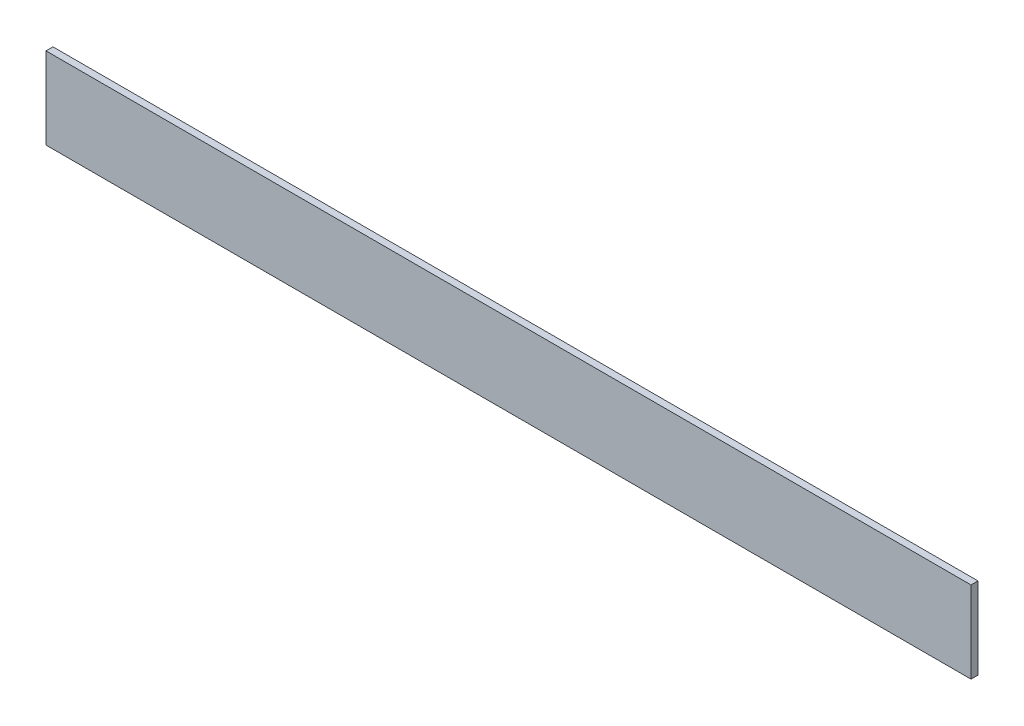
ISO-10303-21;
HEADER;
FILE_DESCRIPTION(('STEP AP214'),'2;1');
FILE_NAME('part.step','',(''),(''),'','','');
FILE_SCHEMA(('AUTOMOTIVE_DESIGN { 1 0 10303 214 1 1 1 1 }'));
ENDSEC;
DATA;
#1=APPLICATION_CONTEXT('core data for automotive mechanical design processes');
#2=APPLICATION_PROTOCOL_DEFINITION('international standard','automotive_design',2000,#1);
#3=PRODUCT_CONTEXT('',#1,'mechanical');
#4=PRODUCT('Part','Part','',(#3));
#5=PRODUCT_RELATED_PRODUCT_CATEGORY('part','',(#4));
#6=PRODUCT_DEFINITION_FORMATION('','',#4);
#7=PRODUCT_DEFINITION_CONTEXT('part definition',#1,'design');
#8=PRODUCT_DEFINITION('design','',#6,#7);
#9=PRODUCT_DEFINITION_SHAPE('','',#8);
#10=(LENGTH_UNIT() NAMED_UNIT(*) SI_UNIT(.MILLI.,.METRE.));
#11=(NAMED_UNIT(*) PLANE_ANGLE_UNIT() SI_UNIT($,.RADIAN.));
#12=(NAMED_UNIT(*) SI_UNIT($,.STERADIAN.) SOLID_ANGLE_UNIT());
#13=UNCERTAINTY_MEASURE_WITH_UNIT(LENGTH_MEASURE(1.E-05),#10,'distance_accuracy_value','');
#14=(GEOMETRIC_REPRESENTATION_CONTEXT(3) GLOBAL_UNCERTAINTY_ASSIGNED_CONTEXT((#13)) GLOBAL_UNIT_ASSIGNED_CONTEXT((#10,
#11,#12)) REPRESENTATION_CONTEXT('',''));
#15=CARTESIAN_POINT('',(0.,0.,0.));
#16=DIRECTION('',(0.,0.,1.));
#17=DIRECTION('',(1.,0.,0.));
#18=AXIS2_PLACEMENT_3D('',#15,#16,#17);
#19=CARTESIAN_POINT('',(215.9,-7.8994,7.8994));
#20=DIRECTION('',(0.,0.,1.));
#21=DIRECTION('',(1.,0.,0.));
#22=AXIS2_PLACEMENT_3D('',#19,#20,#21);
#23=PLANE('',#22);
#24=DIRECTION('',(0.,1.,0.));
#25=VECTOR('',#24,1.);
#26=CARTESIAN_POINT('',(0.,-7.8994,7.8994));
#27=LINE('',#26,#25);
#28=CARTESIAN_POINT('',(0.,-9.525,7.8994));
#29=VERTEX_POINT('',#28);
#30=CARTESIAN_POINT('',(0.,9.525,7.8994));
#31=VERTEX_POINT('',#30);
#32=EDGE_CURVE('E46',#29,#31,#27,.T.);
#33=ORIENTED_EDGE('',*,*,#32,.T.);
#34=DIRECTION('',(-1.,0.,0.));
#35=VECTOR('',#34,1.);
#36=CARTESIAN_POINT('',(215.9,9.525,7.8994));
#37=LINE('',#36,#35);
#38=CARTESIAN_POINT('',(215.9,9.525,7.8994));
#39=VERTEX_POINT('',#38);
#40=EDGE_CURVE('E11',#39,#31,#37,.T.);
#41=ORIENTED_EDGE('',*,*,#40,.F.);
#42=DIRECTION('',(0.,1.,0.));
#43=VECTOR('',#42,1.);
#44=CARTESIAN_POINT('',(215.9,-7.8994,7.8994));
#45=LINE('',#44,#43);
#46=CARTESIAN_POINT('',(215.9,-9.525,7.8994));
#47=VERTEX_POINT('',#46);
#48=EDGE_CURVE('E145',#47,#39,#45,.T.);
#49=ORIENTED_EDGE('',*,*,#48,.F.);
#50=DIRECTION('',(-1.,0.,0.));
#51=VECTOR('',#50,1.);
#52=CARTESIAN_POINT('',(215.9,-9.525,7.8994));
#53=LINE('',#52,#51);
#54=CARTESIAN_POINT('',(196.85,-9.525,7.8994));
#55=VERTEX_POINT('',#54);
#56=EDGE_CURVE('E125',#47,#55,#53,.T.);
#57=ORIENTED_EDGE('',*,*,#56,.T.);
#58=DIRECTION('',(0.,1.,0.));
#59=VECTOR('',#58,1.);
#60=CARTESIAN_POINT('',(196.85,-9.526,7.8994));
#61=LINE('',#60,#59);
#62=CARTESIAN_POINT('',(196.85,-7.8994,7.8994));
#63=VERTEX_POINT('',#62);
#64=EDGE_CURVE('E117',#55,#63,#61,.T.);
#65=ORIENTED_EDGE('',*,*,#64,.T.);
#66=DIRECTION('',(-1.,0.,0.));
#67=VECTOR('',#66,1.);
#68=CARTESIAN_POINT('',(215.9,-7.8994,7.8994));
#69=LINE('',#68,#67);
#70=CARTESIAN_POINT('',(19.05,-7.8994,7.8994));
#71=VERTEX_POINT('',#70);
#72=EDGE_CURVE('E124',#63,#71,#69,.T.);
#73=ORIENTED_EDGE('',*,*,#72,.T.);
#74=DIRECTION('',(0.,1.,0.));
#75=VECTOR('',#74,1.);
#76=CARTESIAN_POINT('',(19.05,-9.526,7.8994));
#77=LINE('',#76,#75);
#78=CARTESIAN_POINT('',(19.05,-9.525,7.8994));
#79=VERTEX_POINT('',#78);
#80=EDGE_CURVE('E155',#79,#71,#77,.T.);
#81=ORIENTED_EDGE('',*,*,#80,.F.);
#82=DIRECTION('',(-1.,0.,0.));
#83=VECTOR('',#82,1.);
#84=CARTESIAN_POINT('',(0.,-9.525,7.8994));
#85=LINE('',#84,#83);
#86=EDGE_CURVE('E149',#79,#29,#85,.T.);
#87=ORIENTED_EDGE('',*,*,#86,.T.);
#88=EDGE_LOOP('',(#33,#41,#49,#57,#65,#73,#81,#87));
#89=FACE_BOUND('',#88,.T.);
#90=ADVANCED_FACE('F32',(#89),#23,.F.);
#91=CARTESIAN_POINT('',(215.9,9.525,9.525));
#92=DIRECTION('',(0.,-1.,0.));
#93=DIRECTION('',(0.,0.,-1.));
#94=AXIS2_PLACEMENT_3D('',#91,#92,#93);
#95=PLANE('',#94);
#96=DIRECTION('',(0.,0.,1.));
#97=VECTOR('',#96,1.);
#98=CARTESIAN_POINT('',(0.,9.525,9.525));
#99=LINE('',#98,#97);
#100=CARTESIAN_POINT('',(0.,9.525,9.525));
#101=VERTEX_POINT('',#100);
#102=EDGE_CURVE('E141',#31,#101,#99,.T.);
#103=ORIENTED_EDGE('',*,*,#102,.T.);
#104=DIRECTION('',(-1.,0.,0.));
#105=VECTOR('',#104,1.);
#106=CARTESIAN_POINT('',(215.9,9.525,9.525));
#107=LINE('',#106,#105);
#108=CARTESIAN_POINT('',(215.9,9.525,9.525));
#109=VERTEX_POINT('',#108);
#110=EDGE_CURVE('E39',#109,#101,#107,.T.);
#111=ORIENTED_EDGE('',*,*,#110,.F.);
#112=DIRECTION('',(0.,0.,1.));
#113=VECTOR('',#112,1.);
#114=CARTESIAN_POINT('',(215.9,9.525,9.525));
#115=LINE('',#114,#113);
#116=EDGE_CURVE('E76',#39,#109,#115,.T.);
#117=ORIENTED_EDGE('',*,*,#116,.F.);
#118=ORIENTED_EDGE('',*,*,#40,.T.);
#119=EDGE_LOOP('',(#103,#111,#117,#118));
#120=FACE_BOUND('',#119,.T.);
#121=ADVANCED_FACE('F178',(#120),#95,.F.);
#122=CARTESIAN_POINT('',(215.9,-9.525,9.525));
#123=DIRECTION('',(0.,0.,-1.));
#124=DIRECTION('',(0.,1.,0.));
#125=AXIS2_PLACEMENT_3D('',#122,#123,#124);
#126=PLANE('',#125);
#127=DIRECTION('',(0.,-1.,0.));
#128=VECTOR('',#127,1.);
#129=CARTESIAN_POINT('',(0.,-9.525,9.525));
#130=LINE('',#129,#128);
#131=CARTESIAN_POINT('',(0.,-9.525,9.525));
#132=VERTEX_POINT('',#131);
#133=EDGE_CURVE('E71',#101,#132,#130,.T.);
#134=ORIENTED_EDGE('',*,*,#133,.T.);
#135=DIRECTION('',(-1.,0.,0.));
#136=VECTOR('',#135,1.);
#137=CARTESIAN_POINT('',(215.9,-9.525,9.525));
#138=LINE('',#137,#136);
#139=CARTESIAN_POINT('',(215.9,-9.525,9.525));
#140=VERTEX_POINT('',#139);
#141=EDGE_CURVE('E133',#140,#132,#138,.T.);
#142=ORIENTED_EDGE('',*,*,#141,.F.);
#143=DIRECTION('',(0.,-1.,0.));
#144=VECTOR('',#143,1.);
#145=CARTESIAN_POINT('',(215.9,-9.525,9.525));
#146=LINE('',#145,#144);
#147=EDGE_CURVE('E55',#109,#140,#146,.T.);
#148=ORIENTED_EDGE('',*,*,#147,.F.);
#149=ORIENTED_EDGE('',*,*,#110,.T.);
#150=EDGE_LOOP('',(#134,#142,#148,#149));
#151=FACE_BOUND('',#150,.T.);
#152=ADVANCED_FACE('F139',(#151),#126,.F.);
#153=CARTESIAN_POINT('',(215.9,-9.525,9.525));
#154=DIRECTION('',(0.,1.,0.));
#155=DIRECTION('',(0.,0.,1.));
#156=AXIS2_PLACEMENT_3D('',#153,#154,#155);
#157=PLANE('',#156);
#158=DIRECTION('',(0.,0.,-1.));
#159=VECTOR('',#158,1.);
#160=CARTESIAN_POINT('',(196.85,-9.525,-9.525));
#161=LINE('',#160,#159);
#162=CARTESIAN_POINT('',(196.85,-9.525,-9.525));
#163=VERTEX_POINT('',#162);
#164=EDGE_CURVE('E113',#55,#163,#161,.T.);
#165=ORIENTED_EDGE('',*,*,#164,.F.);
#166=ORIENTED_EDGE('',*,*,#56,.F.);
#167=DIRECTION('',(0.,0.,-1.));
#168=VECTOR('',#167,1.);
#169=CARTESIAN_POINT('',(215.9,-9.525,9.525));
#170=LINE('',#169,#168);
#171=EDGE_CURVE('E135',#140,#47,#170,.T.);
#172=ORIENTED_EDGE('',*,*,#171,.F.);
#173=ORIENTED_EDGE('',*,*,#141,.T.);
#174=DIRECTION('',(0.,0.,-1.));
#175=VECTOR('',#174,1.);
#176=CARTESIAN_POINT('',(0.,-9.525,9.525));
#177=LINE('',#176,#175);
#178=EDGE_CURVE('E143',#132,#29,#177,.T.);
#179=ORIENTED_EDGE('',*,*,#178,.T.);
#180=ORIENTED_EDGE('',*,*,#86,.F.);
#181=DIRECTION('',(0.,0.,1.));
#182=VECTOR('',#181,1.);
#183=CARTESIAN_POINT('',(19.05,-9.525,-9.525));
#184=LINE('',#183,#182);
#185=CARTESIAN_POINT('',(19.05,-9.525,-9.525));
#186=VERTEX_POINT('',#185);
#187=EDGE_CURVE('E161',#186,#79,#184,.T.);
#188=ORIENTED_EDGE('',*,*,#187,.F.);
#189=DIRECTION('',(-1.,0.,0.));
#190=VECTOR('',#189,1.);
#191=CARTESIAN_POINT('',(215.9,-9.525,-9.525));
#192=LINE('',#191,#190);
#193=EDGE_CURVE('E131',#163,#186,#192,.T.);
#194=ORIENTED_EDGE('',*,*,#193,.F.);
#195=EDGE_LOOP('',(#165,#166,#172,#173,#179,#180,#188,#194));
#196=FACE_BOUND('',#195,.T.);
#197=ADVANCED_FACE('F172',(#196),#157,.F.);
#198=CARTESIAN_POINT('',(215.9,-9.525,-9.525));
#199=DIRECTION('',(0.,0.,1.));
#200=DIRECTION('',(1.,0.,0.));
#201=AXIS2_PLACEMENT_3D('',#198,#199,#200);
#202=PLANE('',#201);
#203=DIRECTION('',(-1.,0.,0.));
#204=VECTOR('',#203,1.);
#205=CARTESIAN_POINT('',(215.9,-7.8994,-9.525));
#206=LINE('',#205,#204);
#207=CARTESIAN_POINT('',(196.85,-7.8994,-9.525));
#208=VERTEX_POINT('',#207);
#209=CARTESIAN_POINT('',(19.05,-7.8994,-9.525));
#210=VERTEX_POINT('',#209);
#211=EDGE_CURVE('E122',#208,#210,#206,.T.);
#212=ORIENTED_EDGE('',*,*,#211,.F.);
#213=DIRECTION('',(0.,1.,0.));
#214=VECTOR('',#213,1.);
#215=CARTESIAN_POINT('',(196.85,-9.526,-9.525));
#216=LINE('',#215,#214);
#217=EDGE_CURVE('E107',#163,#208,#216,.T.);
#218=ORIENTED_EDGE('',*,*,#217,.F.);
#219=ORIENTED_EDGE('',*,*,#193,.T.);
#220=DIRECTION('',(0.,1.,0.));
#221=VECTOR('',#220,1.);
#222=CARTESIAN_POINT('',(19.05,-9.526,-9.525));
#223=LINE('',#222,#221);
#224=EDGE_CURVE('E130',#186,#210,#223,.T.);
#225=ORIENTED_EDGE('',*,*,#224,.T.);
#226=EDGE_LOOP('',(#212,#218,#219,#225));
#227=FACE_BOUND('',#226,.T.);
#228=ADVANCED_FACE('F128',(#227),#202,.F.);
#229=CARTESIAN_POINT('',(215.9,-7.8994,7.8994));
#230=DIRECTION('',(0.,-1.,0.));
#231=DIRECTION('',(0.,0.,-1.));
#232=AXIS2_PLACEMENT_3D('',#229,#230,#231);
#233=PLANE('',#232);
#234=ORIENTED_EDGE('',*,*,#72,.F.);
#235=DIRECTION('',(0.,0.,1.));
#236=VECTOR('',#235,1.);
#237=CARTESIAN_POINT('',(196.85,-7.8994,-9.525));
#238=LINE('',#237,#236);
#239=EDGE_CURVE('E110',#208,#63,#238,.T.);
#240=ORIENTED_EDGE('',*,*,#239,.F.);
#241=ORIENTED_EDGE('',*,*,#211,.T.);
#242=DIRECTION('',(0.,0.,-1.));
#243=VECTOR('',#242,1.);
#244=CARTESIAN_POINT('',(19.05,-7.8994,-9.525));
#245=LINE('',#244,#243);
#246=EDGE_CURVE('E158',#71,#210,#245,.T.);
#247=ORIENTED_EDGE('',*,*,#246,.F.);
#248=EDGE_LOOP('',(#234,#240,#241,#247));
#249=FACE_BOUND('',#248,.T.);
#250=ADVANCED_FACE('F120',(#249),#233,.F.);
#251=CARTESIAN_POINT('',(215.9,0.,0.));
#252=DIRECTION('',(-1.,0.,0.));
#253=DIRECTION('',(0.,0.,1.));
#254=AXIS2_PLACEMENT_3D('',#251,#252,#253);
#255=PLANE('',#254);
#256=ORIENTED_EDGE('',*,*,#171,.T.);
#257=ORIENTED_EDGE('',*,*,#48,.T.);
#258=ORIENTED_EDGE('',*,*,#116,.T.);
#259=ORIENTED_EDGE('',*,*,#147,.T.);
#260=EDGE_LOOP('',(#256,#257,#258,#259));
#261=FACE_BOUND('',#260,.T.);
#262=ADVANCED_FACE('F177',(#261),#255,.F.);
#263=CARTESIAN_POINT('',(0.,0.,0.));
#264=DIRECTION('',(-1.,0.,0.));
#265=DIRECTION('',(0.,0.,1.));
#266=AXIS2_PLACEMENT_3D('',#263,#264,#265);
#267=PLANE('',#266);
#268=ORIENTED_EDGE('',*,*,#32,.F.);
#269=ORIENTED_EDGE('',*,*,#178,.F.);
#270=ORIENTED_EDGE('',*,*,#133,.F.);
#271=ORIENTED_EDGE('',*,*,#102,.F.);
#272=EDGE_LOOP('',(#268,#269,#270,#271));
#273=FACE_BOUND('',#272,.T.);
#274=ADVANCED_FACE('F140',(#273),#267,.T.);
#275=CARTESIAN_POINT('',(19.05,-9.526,-9.525));
#276=DIRECTION('',(1.,0.,0.));
#277=DIRECTION('',(0.,0.,-1.));
#278=AXIS2_PLACEMENT_3D('',#275,#276,#277);
#279=PLANE('',#278);
#280=ORIENTED_EDGE('',*,*,#187,.T.);
#281=ORIENTED_EDGE('',*,*,#80,.T.);
#282=ORIENTED_EDGE('',*,*,#246,.T.);
#283=ORIENTED_EDGE('',*,*,#224,.F.);
#284=EDGE_LOOP('',(#280,#281,#282,#283));
#285=FACE_BOUND('',#284,.T.);
#286=ADVANCED_FACE('F176',(#285),#279,.F.);
#287=CARTESIAN_POINT('',(196.85,-9.526,-9.525));
#288=DIRECTION('',(-1.,0.,0.));
#289=DIRECTION('',(0.,0.,1.));
#290=AXIS2_PLACEMENT_3D('',#287,#288,#289);
#291=PLANE('',#290);
#292=ORIENTED_EDGE('',*,*,#164,.T.);
#293=ORIENTED_EDGE('',*,*,#217,.T.);
#294=ORIENTED_EDGE('',*,*,#239,.T.);
#295=ORIENTED_EDGE('',*,*,#64,.F.);
#296=EDGE_LOOP('',(#292,#293,#294,#295));
#297=FACE_BOUND('',#296,.T.);
#298=ADVANCED_FACE('F109',(#297),#291,.F.);
#299=CLOSED_SHELL('',(#90,#121,#152,#197,#228,#250,#262,#274,#286,#298));
#300=MANIFOLD_SOLID_BREP('B2',#299);
#301=ADVANCED_BREP_SHAPE_REPRESENTATION('',(#18,#300),#14);
#302=SHAPE_DEFINITION_REPRESENTATION(#9,#301);
ENDSEC;
END-ISO-10303-21;
